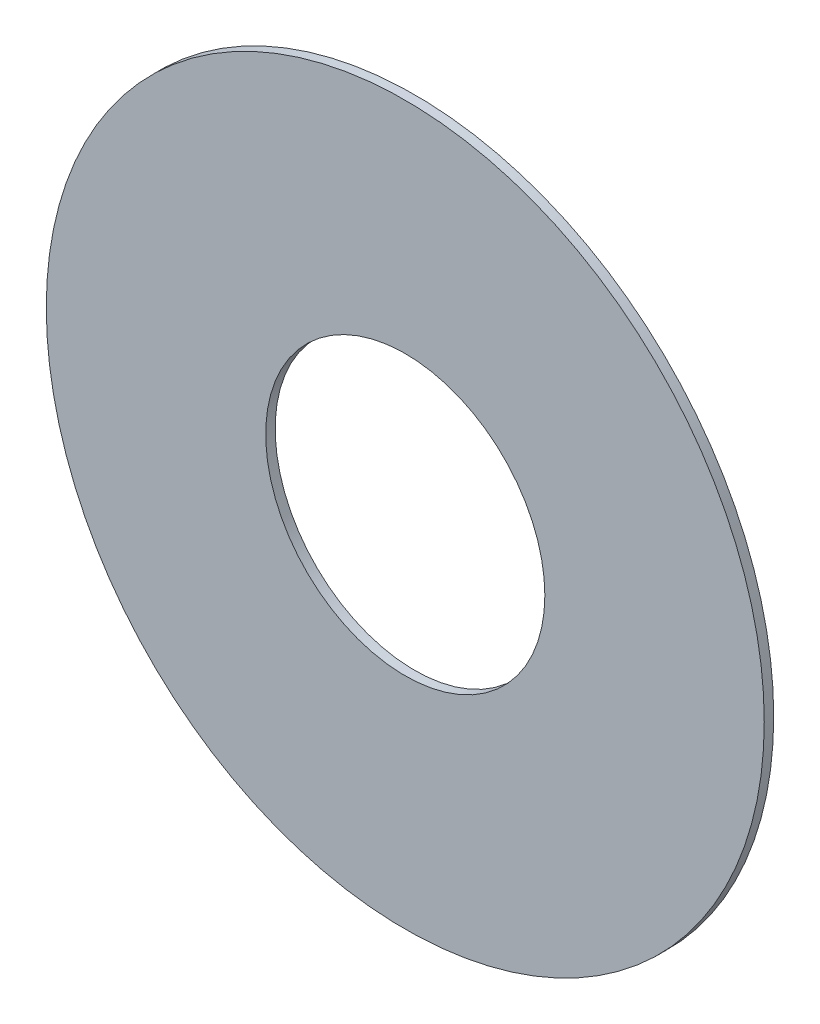
ISO-10303-21;
HEADER;
FILE_DESCRIPTION(('STEP AP214'),'2;1');
FILE_NAME('part.step','',(''),(''),'','','');
FILE_SCHEMA(('AUTOMOTIVE_DESIGN { 1 0 10303 214 1 1 1 1 }'));
ENDSEC;
DATA;
#1=APPLICATION_CONTEXT('core data for automotive mechanical design processes');
#2=APPLICATION_PROTOCOL_DEFINITION('international standard','automotive_design',2000,#1);
#3=PRODUCT_CONTEXT('',#1,'mechanical');
#4=PRODUCT('Part','Part','',(#3));
#5=PRODUCT_RELATED_PRODUCT_CATEGORY('part','',(#4));
#6=PRODUCT_DEFINITION_FORMATION('','',#4);
#7=PRODUCT_DEFINITION_CONTEXT('part definition',#1,'design');
#8=PRODUCT_DEFINITION('design','',#6,#7);
#9=PRODUCT_DEFINITION_SHAPE('','',#8);
#10=(LENGTH_UNIT() NAMED_UNIT(*) SI_UNIT(.MILLI.,.METRE.));
#11=(NAMED_UNIT(*) PLANE_ANGLE_UNIT() SI_UNIT($,.RADIAN.));
#12=(NAMED_UNIT(*) SI_UNIT($,.STERADIAN.) SOLID_ANGLE_UNIT());
#13=UNCERTAINTY_MEASURE_WITH_UNIT(LENGTH_MEASURE(1.E-05),#10,'distance_accuracy_value','');
#14=(GEOMETRIC_REPRESENTATION_CONTEXT(3) GLOBAL_UNCERTAINTY_ASSIGNED_CONTEXT((#13)) GLOBAL_UNIT_ASSIGNED_CONTEXT((#10,
#11,#12)) REPRESENTATION_CONTEXT('',''));
#15=CARTESIAN_POINT('',(0.,0.,0.));
#16=DIRECTION('',(0.,0.,1.));
#17=DIRECTION('',(1.,0.,0.));
#18=AXIS2_PLACEMENT_3D('',#15,#16,#17);
#19=CARTESIAN_POINT('',(0.,0.,-40.5));
#20=DIRECTION('',(0.,0.,1.));
#21=DIRECTION('',(1.,0.,0.));
#22=AXIS2_PLACEMENT_3D('',#19,#20,#21);
#23=PLANE('',#22);
#24=CARTESIAN_POINT('',(0.,0.,-40.5));
#25=DIRECTION('',(0.,0.,1.));
#26=DIRECTION('',(1.,0.,0.));
#27=AXIS2_PLACEMENT_3D('',#24,#25,#26);
#28=CIRCLE('',#27,75.8769230769231);
#29=CARTESIAN_POINT('',(75.8769230769231,0.,-40.5));
#30=VERTEX_POINT('',#29);
#31=EDGE_CURVE('E10',#30,#30,#28,.T.);
#32=ORIENTED_EDGE('',*,*,#31,.T.);
#33=EDGE_LOOP('',(#32));
#34=FACE_BOUND('',#33,.T.);
#35=CARTESIAN_POINT('',(0.,0.,-40.5));
#36=DIRECTION('',(0.,0.,1.));
#37=DIRECTION('',(1.,0.,0.));
#38=AXIS2_PLACEMENT_3D('',#35,#36,#37);
#39=CIRCLE('',#38,29.5);
#40=CARTESIAN_POINT('',(29.5,0.,-40.5));
#41=VERTEX_POINT('',#40);
#42=EDGE_CURVE('E46',#41,#41,#39,.T.);
#43=ORIENTED_EDGE('',*,*,#42,.F.);
#44=EDGE_LOOP('',(#43));
#45=FACE_BOUND('',#44,.T.);
#46=ADVANCED_FACE('F35',(#34,#45),#23,.T.);
#47=CARTESIAN_POINT('',(0.,0.,-42.5));
#48=DIRECTION('',(0.,0.,1.));
#49=DIRECTION('',(1.,0.,0.));
#50=AXIS2_PLACEMENT_3D('',#47,#48,#49);
#51=PLANE('',#50);
#52=CARTESIAN_POINT('',(0.,0.,-42.5));
#53=DIRECTION('',(0.,0.,1.));
#54=DIRECTION('',(1.,0.,0.));
#55=AXIS2_PLACEMENT_3D('',#52,#53,#54);
#56=CIRCLE('',#55,75.8769230769231);
#57=CARTESIAN_POINT('',(75.8769230769231,0.,-42.5));
#58=VERTEX_POINT('',#57);
#59=EDGE_CURVE('E39',#58,#58,#56,.T.);
#60=ORIENTED_EDGE('',*,*,#59,.F.);
#61=EDGE_LOOP('',(#60));
#62=FACE_BOUND('',#61,.T.);
#63=CARTESIAN_POINT('',(0.,0.,-42.5));
#64=DIRECTION('',(0.,0.,1.));
#65=DIRECTION('',(1.,0.,0.));
#66=AXIS2_PLACEMENT_3D('',#63,#64,#65);
#67=CIRCLE('',#66,29.5);
#68=CARTESIAN_POINT('',(29.5,0.,-42.5));
#69=VERTEX_POINT('',#68);
#70=EDGE_CURVE('E48',#69,#69,#67,.T.);
#71=ORIENTED_EDGE('',*,*,#70,.T.);
#72=EDGE_LOOP('',(#71));
#73=FACE_BOUND('',#72,.T.);
#74=ADVANCED_FACE('F58',(#62,#73),#51,.F.);
#75=CARTESIAN_POINT('',(0.,0.,-40.5));
#76=DIRECTION('',(0.,0.,-1.));
#77=DIRECTION('',(-1.,0.,0.));
#78=AXIS2_PLACEMENT_3D('',#75,#76,#77);
#79=CYLINDRICAL_SURFACE('',#78,75.8769230769231);
#80=ORIENTED_EDGE('',*,*,#31,.F.);
#81=EDGE_LOOP('',(#80));
#82=FACE_BOUND('',#81,.T.);
#83=ORIENTED_EDGE('',*,*,#59,.T.);
#84=EDGE_LOOP('',(#83));
#85=FACE_BOUND('',#84,.T.);
#86=ADVANCED_FACE('F37',(#82,#85),#79,.T.);
#87=CARTESIAN_POINT('',(0.,0.,-40.5));
#88=DIRECTION('',(0.,0.,-1.));
#89=DIRECTION('',(-1.,0.,0.));
#90=AXIS2_PLACEMENT_3D('',#87,#88,#89);
#91=CYLINDRICAL_SURFACE('',#90,29.5);
#92=ORIENTED_EDGE('',*,*,#42,.T.);
#93=EDGE_LOOP('',(#92));
#94=FACE_BOUND('',#93,.T.);
#95=ORIENTED_EDGE('',*,*,#70,.F.);
#96=EDGE_LOOP('',(#95));
#97=FACE_BOUND('',#96,.T.);
#98=ADVANCED_FACE('F54',(#94,#97),#91,.F.);
#99=CLOSED_SHELL('',(#46,#74,#86,#98));
#100=MANIFOLD_SOLID_BREP('B2',#99);
#101=ADVANCED_BREP_SHAPE_REPRESENTATION('',(#18,#100),#14);
#102=SHAPE_DEFINITION_REPRESENTATION(#9,#101);
ENDSEC;
END-ISO-10303-21;
